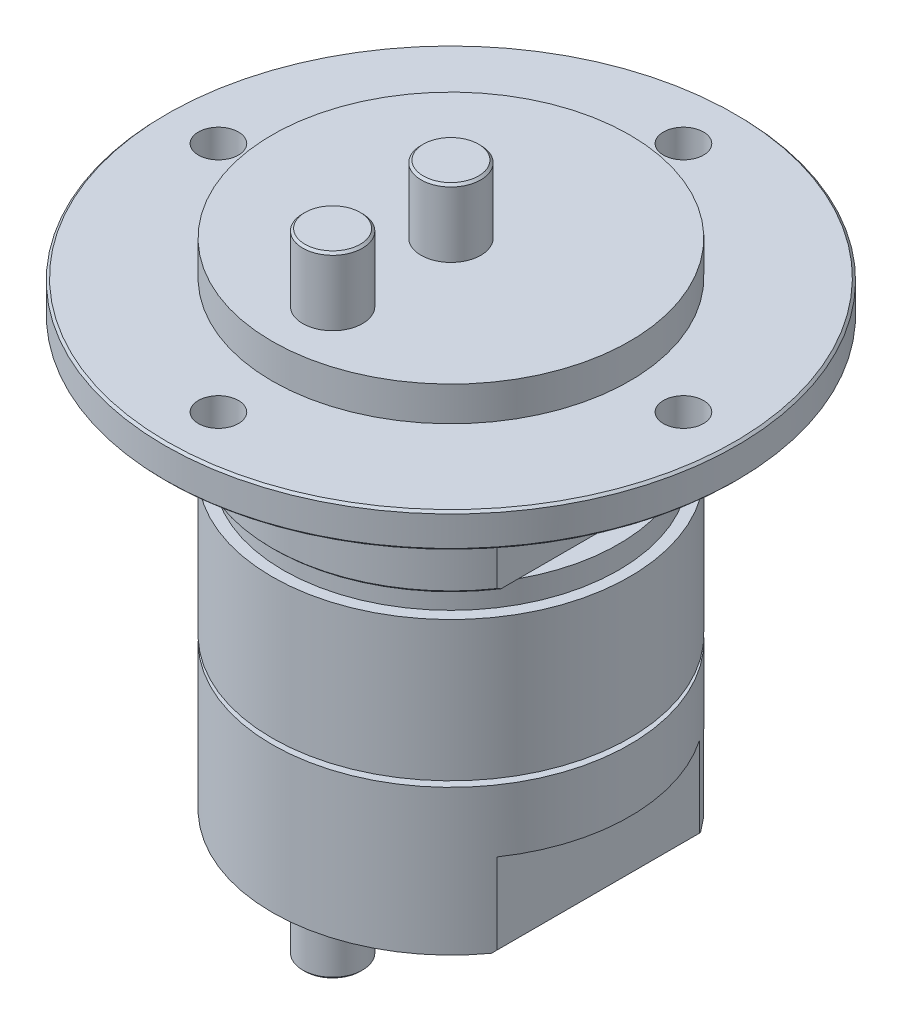
ISO-10303-21;
HEADER;
FILE_DESCRIPTION(('STEP AP214'),'2;1');
FILE_NAME('part.step','',(''),(''),'','','');
FILE_SCHEMA(('AUTOMOTIVE_DESIGN { 1 0 10303 214 1 1 1 1 }'));
ENDSEC;
DATA;
#1=APPLICATION_CONTEXT('core data for automotive mechanical design processes');
#2=APPLICATION_PROTOCOL_DEFINITION('international standard','automotive_design',2000,#1);
#3=PRODUCT_CONTEXT('',#1,'mechanical');
#4=PRODUCT('Part','Part','',(#3));
#5=PRODUCT_RELATED_PRODUCT_CATEGORY('part','',(#4));
#6=PRODUCT_DEFINITION_FORMATION('','',#4);
#7=PRODUCT_DEFINITION_CONTEXT('part definition',#1,'design');
#8=PRODUCT_DEFINITION('design','',#6,#7);
#9=PRODUCT_DEFINITION_SHAPE('','',#8);
#10=(LENGTH_UNIT() NAMED_UNIT(*) SI_UNIT(.MILLI.,.METRE.));
#11=(NAMED_UNIT(*) PLANE_ANGLE_UNIT() SI_UNIT($,.RADIAN.));
#12=(NAMED_UNIT(*) SI_UNIT($,.STERADIAN.) SOLID_ANGLE_UNIT());
#13=UNCERTAINTY_MEASURE_WITH_UNIT(LENGTH_MEASURE(1.E-05),#10,'distance_accuracy_value','');
#14=(GEOMETRIC_REPRESENTATION_CONTEXT(3) GLOBAL_UNCERTAINTY_ASSIGNED_CONTEXT((#13)) GLOBAL_UNIT_ASSIGNED_CONTEXT((#10,
#11,#12)) REPRESENTATION_CONTEXT('',''));
#15=CARTESIAN_POINT('',(0.,0.,0.));
#16=DIRECTION('',(0.,0.,1.));
#17=DIRECTION('',(1.,0.,0.));
#18=AXIS2_PLACEMENT_3D('',#15,#16,#17);
#19=CARTESIAN_POINT('',(0.,50.7192813475427,0.));
#20=DIRECTION('',(0.,1.,0.));
#21=DIRECTION('',(0.,0.,1.));
#22=AXIS2_PLACEMENT_3D('',#19,#20,#21);
#23=CYLINDRICAL_SURFACE('',#22,15.875);
#24=CARTESIAN_POINT('',(0.,-3.05,0.));
#25=DIRECTION('',(0.,1.,0.));
#26=DIRECTION('',(0.,0.,1.));
#27=AXIS2_PLACEMENT_3D('',#24,#25,#26);
#28=CIRCLE('',#27,15.875);
#29=CARTESIAN_POINT('',(0.,-3.05,15.875));
#30=VERTEX_POINT('',#29);
#31=EDGE_CURVE('E448',#30,#30,#28,.T.);
#32=ORIENTED_EDGE('',*,*,#31,.F.);
#33=EDGE_LOOP('',(#32));
#34=FACE_BOUND('',#33,.T.);
#35=DIRECTION('',(0.,1.,0.));
#36=VECTOR('',#35,1.);
#37=CARTESIAN_POINT('',(13.08,50.7192813475427,-8.99606719628081));
#38=LINE('',#37,#36);
#39=CARTESIAN_POINT('',(13.08,-5.65,-8.99606719628081));
#40=VERTEX_POINT('',#39);
#41=CARTESIAN_POINT('',(13.08,-12.85,-8.99606719628081));
#42=VERTEX_POINT('',#41);
#43=EDGE_CURVE('E524',#40,#42,#38,.F.);
#44=ORIENTED_EDGE('',*,*,#43,.T.);
#45=CARTESIAN_POINT('',(0.,-12.85,0.));
#46=DIRECTION('',(0.,-1.,0.));
#47=DIRECTION('',(0.,0.,-1.));
#48=AXIS2_PLACEMENT_3D('',#45,#46,#47);
#49=CIRCLE('',#48,15.875);
#50=CARTESIAN_POINT('',(-13.08,-12.85,-8.99606719628081));
#51=VERTEX_POINT('',#50);
#52=EDGE_CURVE('E223',#42,#51,#49,.F.);
#53=ORIENTED_EDGE('',*,*,#52,.T.);
#54=DIRECTION('',(0.,1.,0.));
#55=VECTOR('',#54,1.);
#56=CARTESIAN_POINT('',(-13.08,50.7192813475427,-8.99606719628081));
#57=LINE('',#56,#55);
#58=CARTESIAN_POINT('',(-13.08,-5.65,-8.99606719628081));
#59=VERTEX_POINT('',#58);
#60=EDGE_CURVE('E532',#59,#51,#57,.F.);
#61=ORIENTED_EDGE('',*,*,#60,.F.);
#62=CARTESIAN_POINT('',(0.,-5.65,0.));
#63=DIRECTION('',(0.,1.,0.));
#64=DIRECTION('',(0.,0.,1.));
#65=AXIS2_PLACEMENT_3D('',#62,#63,#64);
#66=CIRCLE('',#65,15.875);
#67=CARTESIAN_POINT('',(-13.08,-5.65,8.99606719628081));
#68=VERTEX_POINT('',#67);
#69=EDGE_CURVE('E159',#68,#59,#66,.F.);
#70=ORIENTED_EDGE('',*,*,#69,.F.);
#71=DIRECTION('',(0.,1.,0.));
#72=VECTOR('',#71,1.);
#73=CARTESIAN_POINT('',(-13.08,50.7192813475427,8.99606719628081));
#74=LINE('',#73,#72);
#75=CARTESIAN_POINT('',(-13.08,-12.85,8.99606719628081));
#76=VERTEX_POINT('',#75);
#77=EDGE_CURVE('E530',#76,#68,#74,.T.);
#78=ORIENTED_EDGE('',*,*,#77,.F.);
#79=CARTESIAN_POINT('',(0.,-12.85,0.));
#80=DIRECTION('',(0.,-1.,0.));
#81=DIRECTION('',(0.,0.,-1.));
#82=AXIS2_PLACEMENT_3D('',#79,#80,#81);
#83=CIRCLE('',#82,15.875);
#84=CARTESIAN_POINT('',(13.08,-12.85,8.99606719628081));
#85=VERTEX_POINT('',#84);
#86=EDGE_CURVE('E220',#76,#85,#83,.F.);
#87=ORIENTED_EDGE('',*,*,#86,.T.);
#88=DIRECTION('',(0.,1.,0.));
#89=VECTOR('',#88,1.);
#90=CARTESIAN_POINT('',(13.08,50.7192813475427,8.99606719628081));
#91=LINE('',#90,#89);
#92=CARTESIAN_POINT('',(13.08,-5.65,8.99606719628081));
#93=VERTEX_POINT('',#92);
#94=EDGE_CURVE('E147',#85,#93,#91,.T.);
#95=ORIENTED_EDGE('',*,*,#94,.T.);
#96=CARTESIAN_POINT('',(0.,-5.65,0.));
#97=DIRECTION('',(0.,-1.,0.));
#98=DIRECTION('',(0.,0.,-1.));
#99=AXIS2_PLACEMENT_3D('',#96,#97,#98);
#100=CIRCLE('',#99,15.875);
#101=EDGE_CURVE('E158',#93,#40,#100,.F.);
#102=ORIENTED_EDGE('',*,*,#101,.T.);
#103=EDGE_LOOP('',(#44,#53,#61,#70,#78,#87,#95,#102));
#104=FACE_BOUND('',#103,.T.);
#105=ADVANCED_FACE('F34',(#34,#104),#23,.T.);
#106=CARTESIAN_POINT('',(-15.875,-13.05,0.));
#107=DIRECTION('',(0.,-1.,0.));
#108=DIRECTION('',(0.,0.,-1.));
#109=AXIS2_PLACEMENT_3D('',#106,#107,#108);
#110=PLANE('',#109);
#111=DIRECTION('',(0.,0.,1.));
#112=VECTOR('',#111,1.);
#113=CARTESIAN_POINT('',(-13.08,-13.05,-25.4));
#114=LINE('',#113,#112);
#115=CARTESIAN_POINT('',(-13.08,-13.05,-8.63824200864963));
#116=VERTEX_POINT('',#115);
#117=CARTESIAN_POINT('',(-13.08,-13.05,-7.08372959675902));
#118=VERTEX_POINT('',#117);
#119=EDGE_CURVE('E514',#116,#118,#114,.T.);
#120=ORIENTED_EDGE('',*,*,#119,.F.);
#121=CARTESIAN_POINT('',(0.,-13.05,0.));
#122=DIRECTION('',(0.,-1.,0.));
#123=DIRECTION('',(0.,0.,-1.));
#124=AXIS2_PLACEMENT_3D('',#121,#122,#123);
#125=CIRCLE('',#124,15.675);
#126=CARTESIAN_POINT('',(13.08,-13.05,-8.63824200864963));
#127=VERTEX_POINT('',#126);
#128=EDGE_CURVE('E58',#116,#127,#125,.T.);
#129=ORIENTED_EDGE('',*,*,#128,.T.);
#130=DIRECTION('',(0.,0.,1.));
#131=VECTOR('',#130,1.);
#132=CARTESIAN_POINT('',(13.08,-13.05,-25.4));
#133=LINE('',#132,#131);
#134=CARTESIAN_POINT('',(13.08,-13.05,-7.08372959675902));
#135=VERTEX_POINT('',#134);
#136=EDGE_CURVE('E431',#127,#135,#133,.T.);
#137=ORIENTED_EDGE('',*,*,#136,.T.);
#138=CARTESIAN_POINT('',(0.,-13.05,0.));
#139=DIRECTION('',(0.,1.,0.));
#140=DIRECTION('',(0.,0.,1.));
#141=AXIS2_PLACEMENT_3D('',#138,#139,#140);
#142=CIRCLE('',#141,14.875);
#143=EDGE_CURVE('E442',#135,#118,#142,.T.);
#144=ORIENTED_EDGE('',*,*,#143,.T.);
#145=EDGE_LOOP('',(#120,#129,#137,#144));
#146=FACE_BOUND('',#145,.T.);
#147=ADVANCED_FACE('F336',(#146),#110,.T.);
#148=CARTESIAN_POINT('',(13.08,-13.05,7.08372959675902));
#149=VERTEX_POINT('',#148);
#150=CARTESIAN_POINT('',(13.08,-13.05,8.63824200864963));
#151=VERTEX_POINT('',#150);
#152=EDGE_CURVE('E432',#149,#151,#133,.T.);
#153=ORIENTED_EDGE('',*,*,#152,.T.);
#154=CARTESIAN_POINT('',(0.,-13.05,0.));
#155=DIRECTION('',(0.,-1.,0.));
#156=DIRECTION('',(0.,0.,-1.));
#157=AXIS2_PLACEMENT_3D('',#154,#155,#156);
#158=CIRCLE('',#157,15.675);
#159=CARTESIAN_POINT('',(-13.08,-13.05,8.63824200864963));
#160=VERTEX_POINT('',#159);
#161=EDGE_CURVE('E11',#151,#160,#158,.T.);
#162=ORIENTED_EDGE('',*,*,#161,.T.);
#163=CARTESIAN_POINT('',(-13.08,-13.05,7.08372959675902));
#164=VERTEX_POINT('',#163);
#165=EDGE_CURVE('E446',#164,#160,#114,.T.);
#166=ORIENTED_EDGE('',*,*,#165,.F.);
#167=EDGE_CURVE('E440',#164,#149,#142,.T.);
#168=ORIENTED_EDGE('',*,*,#167,.T.);
#169=EDGE_LOOP('',(#153,#162,#166,#168));
#170=FACE_BOUND('',#169,.T.);
#171=ADVANCED_FACE('F310',(#170),#110,.T.);
#172=CARTESIAN_POINT('',(0.,50.7192813475427,0.));
#173=DIRECTION('',(0.,1.,0.));
#174=DIRECTION('',(0.,0.,1.));
#175=AXIS2_PLACEMENT_3D('',#172,#173,#174);
#176=CYLINDRICAL_SURFACE('',#175,15.875);
#177=CARTESIAN_POINT('',(0.,-27.95,0.));
#178=DIRECTION('',(0.,1.,0.));
#179=DIRECTION('',(0.,0.,1.));
#180=AXIS2_PLACEMENT_3D('',#177,#178,#179);
#181=CIRCLE('',#180,15.875);
#182=CARTESIAN_POINT('',(0.,-27.95,15.875));
#183=VERTEX_POINT('',#182);
#184=EDGE_CURVE('E497',#183,#183,#181,.T.);
#185=ORIENTED_EDGE('',*,*,#184,.F.);
#186=EDGE_LOOP('',(#185));
#187=FACE_BOUND('',#186,.T.);
#188=CARTESIAN_POINT('',(0.,-40.85,0.));
#189=DIRECTION('',(0.,1.,0.));
#190=DIRECTION('',(0.,0.,1.));
#191=AXIS2_PLACEMENT_3D('',#188,#189,#190);
#192=CIRCLE('',#191,15.875);
#193=CARTESIAN_POINT('',(-12.88,-40.85,9.28015220780346));
#194=VERTEX_POINT('',#193);
#195=CARTESIAN_POINT('',(12.88,-40.85,9.28015220780346));
#196=VERTEX_POINT('',#195);
#197=EDGE_CURVE('E495',#194,#196,#192,.T.);
#198=ORIENTED_EDGE('',*,*,#197,.T.);
#199=CARTESIAN_POINT('',(0.,-53.7299999999999,0.));
#200=DIRECTION('',(-0.707106781186544,0.707106781186551,0.));
#201=DIRECTION('',(0.707106781186551,0.707106781186544,0.));
#202=AXIS2_PLACEMENT_3D('',#199,#200,#201);
#203=ELLIPSE('',#202,22.4506403026728,15.875);
#204=CARTESIAN_POINT('',(13.08,-40.65,8.99606719628081));
#205=VERTEX_POINT('',#204);
#206=EDGE_CURVE('E178',#196,#205,#203,.T.);
#207=ORIENTED_EDGE('',*,*,#206,.T.);
#208=DIRECTION('',(0.,1.,0.));
#209=VECTOR('',#208,1.);
#210=CARTESIAN_POINT('',(13.08,50.7192813475427,8.99606719628081));
#211=LINE('',#210,#209);
#212=CARTESIAN_POINT('',(13.08,-33.4849643358104,8.99606719628081));
#213=VERTEX_POINT('',#212);
#214=EDGE_CURVE('E148',#205,#213,#211,.T.);
#215=ORIENTED_EDGE('',*,*,#214,.T.);
#216=CARTESIAN_POINT('',(0.,-33.4849643358104,0.));
#217=DIRECTION('',(0.,-1.,0.));
#218=DIRECTION('',(0.,0.,-1.));
#219=AXIS2_PLACEMENT_3D('',#216,#217,#218);
#220=CIRCLE('',#219,15.875);
#221=CARTESIAN_POINT('',(13.08,-33.4849643358104,-8.99606719628081));
#222=VERTEX_POINT('',#221);
#223=EDGE_CURVE('E153',#213,#222,#220,.F.);
#224=ORIENTED_EDGE('',*,*,#223,.T.);
#225=DIRECTION('',(0.,1.,0.));
#226=VECTOR('',#225,1.);
#227=CARTESIAN_POINT('',(13.08,50.7192813475427,-8.99606719628081));
#228=LINE('',#227,#226);
#229=CARTESIAN_POINT('',(13.08,-40.65,-8.99606719628081));
#230=VERTEX_POINT('',#229);
#231=EDGE_CURVE('E137',#222,#230,#228,.F.);
#232=ORIENTED_EDGE('',*,*,#231,.T.);
#233=CARTESIAN_POINT('',(0.,-53.7299999999999,0.));
#234=DIRECTION('',(-0.707106781186544,0.707106781186551,0.));
#235=DIRECTION('',(0.707106781186551,0.707106781186544,0.));
#236=AXIS2_PLACEMENT_3D('',#233,#234,#235);
#237=ELLIPSE('',#236,22.4506403026728,15.875);
#238=CARTESIAN_POINT('',(12.88,-40.85,-9.28015220780346));
#239=VERTEX_POINT('',#238);
#240=EDGE_CURVE('E176',#230,#239,#237,.T.);
#241=ORIENTED_EDGE('',*,*,#240,.T.);
#242=CARTESIAN_POINT('',(-12.88,-40.85,-9.28015220780346));
#243=VERTEX_POINT('',#242);
#244=EDGE_CURVE('E481',#239,#243,#192,.T.);
#245=ORIENTED_EDGE('',*,*,#244,.T.);
#246=CARTESIAN_POINT('',(0.,-53.73,0.));
#247=DIRECTION('',(-0.707106781186548,-0.707106781186548,0.));
#248=DIRECTION('',(-0.707106781186548,0.707106781186548,0.));
#249=AXIS2_PLACEMENT_3D('',#246,#247,#248);
#250=ELLIPSE('',#249,22.4506403026729,15.875);
#251=CARTESIAN_POINT('',(-13.08,-40.65,-8.99606719628081));
#252=VERTEX_POINT('',#251);
#253=EDGE_CURVE('E172',#243,#252,#250,.F.);
#254=ORIENTED_EDGE('',*,*,#253,.T.);
#255=DIRECTION('',(0.,1.,0.));
#256=VECTOR('',#255,1.);
#257=CARTESIAN_POINT('',(-13.08,50.7192813475427,-8.99606719628081));
#258=LINE('',#257,#256);
#259=CARTESIAN_POINT('',(-13.08,-33.4849643358104,-8.99606719628081));
#260=VERTEX_POINT('',#259);
#261=EDGE_CURVE('E527',#260,#252,#258,.F.);
#262=ORIENTED_EDGE('',*,*,#261,.F.);
#263=CARTESIAN_POINT('',(0.,-33.4849643358104,0.));
#264=DIRECTION('',(0.,1.,0.));
#265=DIRECTION('',(0.,0.,1.));
#266=AXIS2_PLACEMENT_3D('',#263,#264,#265);
#267=CIRCLE('',#266,15.875);
#268=CARTESIAN_POINT('',(-13.08,-33.4849643358104,8.99606719628081));
#269=VERTEX_POINT('',#268);
#270=EDGE_CURVE('E164',#269,#260,#267,.F.);
#271=ORIENTED_EDGE('',*,*,#270,.F.);
#272=DIRECTION('',(0.,1.,0.));
#273=VECTOR('',#272,1.);
#274=CARTESIAN_POINT('',(-13.08,50.7192813475427,8.99606719628081));
#275=LINE('',#274,#273);
#276=CARTESIAN_POINT('',(-13.08,-40.65,8.99606719628081));
#277=VERTEX_POINT('',#276);
#278=EDGE_CURVE('E525',#277,#269,#275,.T.);
#279=ORIENTED_EDGE('',*,*,#278,.F.);
#280=CARTESIAN_POINT('',(0.,-53.73,0.));
#281=DIRECTION('',(-0.707106781186548,-0.707106781186548,0.));
#282=DIRECTION('',(-0.707106781186548,0.707106781186548,0.));
#283=AXIS2_PLACEMENT_3D('',#280,#281,#282);
#284=ELLIPSE('',#283,22.4506403026729,15.875);
#285=EDGE_CURVE('E174',#277,#194,#284,.F.);
#286=ORIENTED_EDGE('',*,*,#285,.T.);
#287=EDGE_LOOP('',(#198,#207,#215,#224,#232,#241,#245,#254,#262,#271,#279,#286));
#288=FACE_BOUND('',#287,.T.);
#289=ADVANCED_FACE('F157',(#187,#288),#176,.T.);
#290=CARTESIAN_POINT('',(-15.875,-40.85,0.));
#291=DIRECTION('',(0.,-1.,0.));
#292=DIRECTION('',(0.,0.,-1.));
#293=AXIS2_PLACEMENT_3D('',#290,#291,#292);
#294=PLANE('',#293);
#295=CARTESIAN_POINT('',(0.,-40.85,10.5));
#296=DIRECTION('',(0.,-1.,0.));
#297=DIRECTION('',(0.,0.,-1.));
#298=AXIS2_PLACEMENT_3D('',#295,#296,#297);
#299=CIRCLE('',#298,2.65);
#300=CARTESIAN_POINT('',(0.,-40.85,7.85));
#301=VERTEX_POINT('',#300);
#302=EDGE_CURVE('E465',#301,#301,#299,.T.);
#303=ORIENTED_EDGE('',*,*,#302,.F.);
#304=EDGE_LOOP('',(#303));
#305=FACE_BOUND('',#304,.T.);
#306=CARTESIAN_POINT('',(0.,-40.85,0.));
#307=DIRECTION('',(0.,-1.,0.));
#308=DIRECTION('',(0.,0.,-1.));
#309=AXIS2_PLACEMENT_3D('',#306,#307,#308);
#310=CIRCLE('',#309,2.65);
#311=CARTESIAN_POINT('',(0.,-40.85,-2.65));
#312=VERTEX_POINT('',#311);
#313=EDGE_CURVE('E461',#312,#312,#310,.T.);
#314=ORIENTED_EDGE('',*,*,#313,.F.);
#315=EDGE_LOOP('',(#314));
#316=FACE_BOUND('',#315,.T.);
#317=ORIENTED_EDGE('',*,*,#244,.F.);
#318=DIRECTION('',(0.,0.,1.));
#319=VECTOR('',#318,1.);
#320=CARTESIAN_POINT('',(12.88,-40.85,0.));
#321=LINE('',#320,#319);
#322=EDGE_CURVE('E169',#239,#196,#321,.T.);
#323=ORIENTED_EDGE('',*,*,#322,.T.);
#324=ORIENTED_EDGE('',*,*,#197,.F.);
#325=DIRECTION('',(0.,0.,-1.));
#326=VECTOR('',#325,1.);
#327=CARTESIAN_POINT('',(-12.88,-40.85,-8.99606719628081));
#328=LINE('',#327,#326);
#329=EDGE_CURVE('E162',#194,#243,#328,.T.);
#330=ORIENTED_EDGE('',*,*,#329,.T.);
#331=EDGE_LOOP('',(#317,#323,#324,#330));
#332=FACE_BOUND('',#331,.T.);
#333=ADVANCED_FACE('F303',(#305,#316,#332),#294,.T.);
#334=CARTESIAN_POINT('',(0.,3.05,0.));
#335=DIRECTION('',(0.,1.,0.));
#336=DIRECTION('',(0.,0.,1.));
#337=AXIS2_PLACEMENT_3D('',#334,#335,#336);
#338=PLANE('',#337);
#339=CARTESIAN_POINT('',(0.,3.05,10.5));
#340=DIRECTION('',(0.,1.,0.));
#341=DIRECTION('',(0.,0.,1.));
#342=AXIS2_PLACEMENT_3D('',#339,#340,#341);
#343=CIRCLE('',#342,2.65);
#344=CARTESIAN_POINT('',(0.,3.05,13.15));
#345=VERTEX_POINT('',#344);
#346=EDGE_CURVE('E468',#345,#345,#343,.T.);
#347=ORIENTED_EDGE('',*,*,#346,.F.);
#348=EDGE_LOOP('',(#347));
#349=FACE_BOUND('',#348,.T.);
#350=CARTESIAN_POINT('',(0.,3.05,0.));
#351=DIRECTION('',(0.,1.,0.));
#352=DIRECTION('',(0.,0.,1.));
#353=AXIS2_PLACEMENT_3D('',#350,#351,#352);
#354=CIRCLE('',#353,2.65);
#355=CARTESIAN_POINT('',(0.,3.05,2.65));
#356=VERTEX_POINT('',#355);
#357=EDGE_CURVE('E464',#356,#356,#354,.T.);
#358=ORIENTED_EDGE('',*,*,#357,.F.);
#359=EDGE_LOOP('',(#358));
#360=FACE_BOUND('',#359,.T.);
#361=CARTESIAN_POINT('',(0.,3.05,0.));
#362=DIRECTION('',(0.,1.,0.));
#363=DIRECTION('',(0.,0.,1.));
#364=AXIS2_PLACEMENT_3D('',#361,#362,#363);
#365=CIRCLE('',#364,15.875);
#366=CARTESIAN_POINT('',(0.,3.05,15.875));
#367=VERTEX_POINT('',#366);
#368=EDGE_CURVE('E458',#367,#367,#365,.T.);
#369=ORIENTED_EDGE('',*,*,#368,.T.);
#370=EDGE_LOOP('',(#369));
#371=FACE_BOUND('',#370,.T.);
#372=ADVANCED_FACE('F306',(#349,#360,#371),#338,.T.);
#373=CARTESIAN_POINT('',(0.,50.7192813475427,0.));
#374=DIRECTION('',(0.,1.,0.));
#375=DIRECTION('',(0.,0.,1.));
#376=AXIS2_PLACEMENT_3D('',#373,#374,#375);
#377=CYLINDRICAL_SURFACE('',#376,15.875);
#378=CARTESIAN_POINT('',(0.,0.,0.));
#379=DIRECTION('',(0.,1.,0.));
#380=DIRECTION('',(0.,0.,1.));
#381=AXIS2_PLACEMENT_3D('',#378,#379,#380);
#382=CIRCLE('',#381,15.875);
#383=CARTESIAN_POINT('',(0.,0.,15.875));
#384=VERTEX_POINT('',#383);
#385=EDGE_CURVE('E455',#384,#384,#382,.T.);
#386=ORIENTED_EDGE('',*,*,#385,.T.);
#387=EDGE_LOOP('',(#386));
#388=FACE_BOUND('',#387,.T.);
#389=ORIENTED_EDGE('',*,*,#368,.F.);
#390=EDGE_LOOP('',(#389));
#391=FACE_BOUND('',#390,.T.);
#392=ADVANCED_FACE('F352',(#388,#391),#377,.T.);
#393=CARTESIAN_POINT('',(-15.875,0.,0.));
#394=DIRECTION('',(0.,1.,0.));
#395=DIRECTION('',(0.,0.,1.));
#396=AXIS2_PLACEMENT_3D('',#393,#394,#395);
#397=PLANE('',#396);
#398=CARTESIAN_POINT('',(0.,0.,0.));
#399=DIRECTION('',(0.,1.,0.));
#400=DIRECTION('',(0.,0.,1.));
#401=AXIS2_PLACEMENT_3D('',#398,#399,#400);
#402=CIRCLE('',#401,25.2);
#403=CARTESIAN_POINT('',(0.,0.,25.2));
#404=VERTEX_POINT('',#403);
#405=EDGE_CURVE('E217',#404,#404,#402,.T.);
#406=ORIENTED_EDGE('',*,*,#405,.T.);
#407=EDGE_LOOP('',(#406));
#408=FACE_BOUND('',#407,.T.);
#409=CARTESIAN_POINT('',(0.,0.,-20.64));
#410=DIRECTION('',(0.,1.,0.));
#411=DIRECTION('',(0.,0.,1.));
#412=AXIS2_PLACEMENT_3D('',#409,#410,#411);
#413=CIRCLE('',#412,1.78);
#414=CARTESIAN_POINT('',(0.,0.,-18.86));
#415=VERTEX_POINT('',#414);
#416=EDGE_CURVE('E473',#415,#415,#413,.T.);
#417=ORIENTED_EDGE('',*,*,#416,.F.);
#418=EDGE_LOOP('',(#417));
#419=FACE_BOUND('',#418,.T.);
#420=CARTESIAN_POINT('',(-20.64,0.,0.));
#421=DIRECTION('',(0.,1.,0.));
#422=DIRECTION('',(0.,0.,1.));
#423=AXIS2_PLACEMENT_3D('',#420,#421,#422);
#424=CIRCLE('',#423,1.78);
#425=CARTESIAN_POINT('',(-20.64,0.,1.78));
#426=VERTEX_POINT('',#425);
#427=EDGE_CURVE('E537',#426,#426,#424,.T.);
#428=ORIENTED_EDGE('',*,*,#427,.F.);
#429=EDGE_LOOP('',(#428));
#430=FACE_BOUND('',#429,.T.);
#431=CARTESIAN_POINT('',(0.,0.,20.64));
#432=DIRECTION('',(0.,1.,0.));
#433=DIRECTION('',(0.,0.,1.));
#434=AXIS2_PLACEMENT_3D('',#431,#432,#433);
#435=CIRCLE('',#434,1.78);
#436=CARTESIAN_POINT('',(0.,0.,22.42));
#437=VERTEX_POINT('',#436);
#438=EDGE_CURVE('E539',#437,#437,#435,.T.);
#439=ORIENTED_EDGE('',*,*,#438,.F.);
#440=EDGE_LOOP('',(#439));
#441=FACE_BOUND('',#440,.T.);
#442=CARTESIAN_POINT('',(20.64,0.,0.));
#443=DIRECTION('',(0.,1.,0.));
#444=DIRECTION('',(0.,0.,1.));
#445=AXIS2_PLACEMENT_3D('',#442,#443,#444);
#446=CIRCLE('',#445,1.78);
#447=CARTESIAN_POINT('',(20.64,0.,1.78));
#448=VERTEX_POINT('',#447);
#449=EDGE_CURVE('E491',#448,#448,#446,.T.);
#450=ORIENTED_EDGE('',*,*,#449,.F.);
#451=EDGE_LOOP('',(#450));
#452=FACE_BOUND('',#451,.T.);
#453=ORIENTED_EDGE('',*,*,#385,.F.);
#454=EDGE_LOOP('',(#453));
#455=FACE_BOUND('',#454,.T.);
#456=ADVANCED_FACE('F348',(#408,#419,#430,#441,#452,#455),#397,.T.);
#457=CARTESIAN_POINT('',(0.,50.7192813475427,0.));
#458=DIRECTION('',(0.,1.,0.));
#459=DIRECTION('',(0.,0.,1.));
#460=AXIS2_PLACEMENT_3D('',#457,#458,#459);
#461=CYLINDRICAL_SURFACE('',#460,25.4);
#462=CARTESIAN_POINT('',(0.,-2.84999999999999,0.));
#463=DIRECTION('',(0.,-1.,0.));
#464=DIRECTION('',(0.,0.,-1.));
#465=AXIS2_PLACEMENT_3D('',#462,#463,#464);
#466=CIRCLE('',#465,25.4);
#467=CARTESIAN_POINT('',(0.,-2.84999999999999,-25.4));
#468=VERTEX_POINT('',#467);
#469=EDGE_CURVE('E211',#468,#468,#466,.F.);
#470=ORIENTED_EDGE('',*,*,#469,.T.);
#471=EDGE_LOOP('',(#470));
#472=FACE_BOUND('',#471,.T.);
#473=CARTESIAN_POINT('',(0.,-0.199999999999999,0.));
#474=DIRECTION('',(0.,1.,0.));
#475=DIRECTION('',(0.,0.,1.));
#476=AXIS2_PLACEMENT_3D('',#473,#474,#475);
#477=CIRCLE('',#476,25.4);
#478=CARTESIAN_POINT('',(0.,-0.199999999999999,25.4));
#479=VERTEX_POINT('',#478);
#480=EDGE_CURVE('E208',#479,#479,#477,.F.);
#481=ORIENTED_EDGE('',*,*,#480,.T.);
#482=EDGE_LOOP('',(#481));
#483=FACE_BOUND('',#482,.T.);
#484=ADVANCED_FACE('F344',(#472,#483),#461,.T.);
#485=CARTESIAN_POINT('',(-25.4,-3.05,0.));
#486=DIRECTION('',(0.,-1.,0.));
#487=DIRECTION('',(0.,0.,-1.));
#488=AXIS2_PLACEMENT_3D('',#485,#486,#487);
#489=PLANE('',#488);
#490=CARTESIAN_POINT('',(0.,-3.05,0.));
#491=DIRECTION('',(0.,-1.,0.));
#492=DIRECTION('',(0.,0.,-1.));
#493=AXIS2_PLACEMENT_3D('',#490,#491,#492);
#494=CIRCLE('',#493,25.2);
#495=CARTESIAN_POINT('',(0.,-3.05,-25.2));
#496=VERTEX_POINT('',#495);
#497=EDGE_CURVE('E214',#496,#496,#494,.T.);
#498=ORIENTED_EDGE('',*,*,#497,.T.);
#499=EDGE_LOOP('',(#498));
#500=FACE_BOUND('',#499,.T.);
#501=CARTESIAN_POINT('',(0.,-3.05,-20.64));
#502=DIRECTION('',(0.,-1.,0.));
#503=DIRECTION('',(0.,0.,-1.));
#504=AXIS2_PLACEMENT_3D('',#501,#502,#503);
#505=CIRCLE('',#504,1.78);
#506=CARTESIAN_POINT('',(0.,-3.05,-22.42));
#507=VERTEX_POINT('',#506);
#508=EDGE_CURVE('E479',#507,#507,#505,.T.);
#509=ORIENTED_EDGE('',*,*,#508,.F.);
#510=EDGE_LOOP('',(#509));
#511=FACE_BOUND('',#510,.T.);
#512=CARTESIAN_POINT('',(-20.64,-3.05,0.));
#513=DIRECTION('',(0.,-1.,0.));
#514=DIRECTION('',(0.,0.,-1.));
#515=AXIS2_PLACEMENT_3D('',#512,#513,#514);
#516=CIRCLE('',#515,1.78);
#517=CARTESIAN_POINT('',(-20.64,-3.05,-1.78));
#518=VERTEX_POINT('',#517);
#519=EDGE_CURVE('E476',#518,#518,#516,.T.);
#520=ORIENTED_EDGE('',*,*,#519,.F.);
#521=EDGE_LOOP('',(#520));
#522=FACE_BOUND('',#521,.T.);
#523=CARTESIAN_POINT('',(0.,-3.05,20.64));
#524=DIRECTION('',(0.,-1.,0.));
#525=DIRECTION('',(0.,0.,-1.));
#526=AXIS2_PLACEMENT_3D('',#523,#524,#525);
#527=CIRCLE('',#526,1.78);
#528=CARTESIAN_POINT('',(0.,-3.05,18.86));
#529=VERTEX_POINT('',#528);
#530=EDGE_CURVE('E472',#529,#529,#527,.T.);
#531=ORIENTED_EDGE('',*,*,#530,.F.);
#532=EDGE_LOOP('',(#531));
#533=FACE_BOUND('',#532,.T.);
#534=CARTESIAN_POINT('',(20.64,-3.05,0.));
#535=DIRECTION('',(0.,-1.,0.));
#536=DIRECTION('',(0.,0.,-1.));
#537=AXIS2_PLACEMENT_3D('',#534,#535,#536);
#538=CIRCLE('',#537,1.78);
#539=CARTESIAN_POINT('',(20.64,-3.05,-1.78));
#540=VERTEX_POINT('',#539);
#541=EDGE_CURVE('E469',#540,#540,#538,.T.);
#542=ORIENTED_EDGE('',*,*,#541,.F.);
#543=EDGE_LOOP('',(#542));
#544=FACE_BOUND('',#543,.T.);
#545=ORIENTED_EDGE('',*,*,#31,.T.);
#546=EDGE_LOOP('',(#545));
#547=FACE_BOUND('',#546,.T.);
#548=ADVANCED_FACE('F334',(#500,#511,#522,#533,#544,#547),#489,.T.);
#549=CARTESIAN_POINT('',(0.,50.7192813475427,0.));
#550=DIRECTION('',(0.,1.,0.));
#551=DIRECTION('',(0.,0.,1.));
#552=AXIS2_PLACEMENT_3D('',#549,#550,#551);
#553=CYLINDRICAL_SURFACE('',#552,14.875);
#554=CARTESIAN_POINT('',(0.,-15.05,0.));
#555=DIRECTION('',(0.,1.,0.));
#556=DIRECTION('',(0.,0.,1.));
#557=AXIS2_PLACEMENT_3D('',#554,#555,#556);
#558=CIRCLE('',#557,14.875);
#559=CARTESIAN_POINT('',(0.,-15.05,14.875));
#560=VERTEX_POINT('',#559);
#561=EDGE_CURVE('E451',#560,#560,#558,.T.);
#562=ORIENTED_EDGE('',*,*,#561,.T.);
#563=EDGE_LOOP('',(#562));
#564=FACE_BOUND('',#563,.T.);
#565=EDGE_CURVE('E447',#118,#164,#142,.T.);
#566=ORIENTED_EDGE('',*,*,#565,.F.);
#567=ORIENTED_EDGE('',*,*,#143,.F.);
#568=EDGE_CURVE('E429',#149,#135,#142,.T.);
#569=ORIENTED_EDGE('',*,*,#568,.F.);
#570=ORIENTED_EDGE('',*,*,#167,.F.);
#571=EDGE_LOOP('',(#566,#567,#569,#570));
#572=FACE_BOUND('',#571,.T.);
#573=ADVANCED_FACE('F330',(#564,#572),#553,.T.);
#574=CARTESIAN_POINT('',(-14.875,-15.05,0.));
#575=DIRECTION('',(0.,1.,0.));
#576=DIRECTION('',(0.,0.,1.));
#577=AXIS2_PLACEMENT_3D('',#574,#575,#576);
#578=PLANE('',#577);
#579=CARTESIAN_POINT('',(0.,-15.05,0.));
#580=DIRECTION('',(0.,1.,0.));
#581=DIRECTION('',(0.,0.,1.));
#582=AXIS2_PLACEMENT_3D('',#579,#580,#581);
#583=CIRCLE('',#582,15.875);
#584=CARTESIAN_POINT('',(0.,-15.05,15.875));
#585=VERTEX_POINT('',#584);
#586=EDGE_CURVE('E508',#585,#585,#583,.T.);
#587=ORIENTED_EDGE('',*,*,#586,.T.);
#588=EDGE_LOOP('',(#587));
#589=FACE_BOUND('',#588,.T.);
#590=ORIENTED_EDGE('',*,*,#561,.F.);
#591=EDGE_LOOP('',(#590));
#592=FACE_BOUND('',#591,.T.);
#593=ADVANCED_FACE('F326',(#589,#592),#578,.T.);
#594=CARTESIAN_POINT('',(0.,50.7192813475427,0.));
#595=DIRECTION('',(0.,1.,0.));
#596=DIRECTION('',(0.,0.,1.));
#597=AXIS2_PLACEMENT_3D('',#594,#595,#596);
#598=CYLINDRICAL_SURFACE('',#597,15.875);
#599=CARTESIAN_POINT('',(0.,-27.45,0.));
#600=DIRECTION('',(0.,1.,0.));
#601=DIRECTION('',(0.,0.,1.));
#602=AXIS2_PLACEMENT_3D('',#599,#600,#601);
#603=CIRCLE('',#602,15.875);
#604=CARTESIAN_POINT('',(0.,-27.45,15.875));
#605=VERTEX_POINT('',#604);
#606=EDGE_CURVE('E506',#605,#605,#603,.T.);
#607=ORIENTED_EDGE('',*,*,#606,.T.);
#608=EDGE_LOOP('',(#607));
#609=FACE_BOUND('',#608,.T.);
#610=ORIENTED_EDGE('',*,*,#586,.F.);
#611=EDGE_LOOP('',(#610));
#612=FACE_BOUND('',#611,.T.);
#613=ADVANCED_FACE('F322',(#609,#612),#598,.T.);
#614=CARTESIAN_POINT('',(-15.875,-27.45,0.));
#615=DIRECTION('',(0.,-1.,0.));
#616=DIRECTION('',(0.,0.,-1.));
#617=AXIS2_PLACEMENT_3D('',#614,#615,#616);
#618=PLANE('',#617);
#619=CARTESIAN_POINT('',(0.,-27.45,0.));
#620=DIRECTION('',(0.,1.,0.));
#621=DIRECTION('',(0.,0.,1.));
#622=AXIS2_PLACEMENT_3D('',#619,#620,#621);
#623=CIRCLE('',#622,14.875);
#624=CARTESIAN_POINT('',(0.,-27.45,14.875));
#625=VERTEX_POINT('',#624);
#626=EDGE_CURVE('E503',#625,#625,#623,.T.);
#627=ORIENTED_EDGE('',*,*,#626,.T.);
#628=EDGE_LOOP('',(#627));
#629=FACE_BOUND('',#628,.T.);
#630=ORIENTED_EDGE('',*,*,#606,.F.);
#631=EDGE_LOOP('',(#630));
#632=FACE_BOUND('',#631,.T.);
#633=ADVANCED_FACE('F318',(#629,#632),#618,.T.);
#634=CARTESIAN_POINT('',(0.,50.7192813475427,0.));
#635=DIRECTION('',(0.,1.,0.));
#636=DIRECTION('',(0.,0.,1.));
#637=AXIS2_PLACEMENT_3D('',#634,#635,#636);
#638=CYLINDRICAL_SURFACE('',#637,14.875);
#639=CARTESIAN_POINT('',(0.,-27.95,0.));
#640=DIRECTION('',(0.,1.,0.));
#641=DIRECTION('',(0.,0.,1.));
#642=AXIS2_PLACEMENT_3D('',#639,#640,#641);
#643=CIRCLE('',#642,14.875);
#644=CARTESIAN_POINT('',(0.,-27.95,14.875));
#645=VERTEX_POINT('',#644);
#646=EDGE_CURVE('E500',#645,#645,#643,.T.);
#647=ORIENTED_EDGE('',*,*,#646,.T.);
#648=EDGE_LOOP('',(#647));
#649=FACE_BOUND('',#648,.T.);
#650=ORIENTED_EDGE('',*,*,#626,.F.);
#651=EDGE_LOOP('',(#650));
#652=FACE_BOUND('',#651,.T.);
#653=ADVANCED_FACE('F314',(#649,#652),#638,.T.);
#654=CARTESIAN_POINT('',(-14.875,-27.95,0.));
#655=DIRECTION('',(0.,1.,0.));
#656=DIRECTION('',(0.,0.,1.));
#657=AXIS2_PLACEMENT_3D('',#654,#655,#656);
#658=PLANE('',#657);
#659=ORIENTED_EDGE('',*,*,#184,.T.);
#660=EDGE_LOOP('',(#659));
#661=FACE_BOUND('',#660,.T.);
#662=ORIENTED_EDGE('',*,*,#646,.F.);
#663=EDGE_LOOP('',(#662));
#664=FACE_BOUND('',#663,.T.);
#665=ADVANCED_FACE('F298',(#661,#664),#658,.T.);
#666=CARTESIAN_POINT('',(0.,-46.85,0.));
#667=DIRECTION('',(0.,1.,0.));
#668=DIRECTION('',(0.,0.,1.));
#669=AXIS2_PLACEMENT_3D('',#666,#667,#668);
#670=PLANE('',#669);
#671=CARTESIAN_POINT('',(0.,-46.85,0.));
#672=DIRECTION('',(0.,1.,0.));
#673=DIRECTION('',(0.,0.,1.));
#674=AXIS2_PLACEMENT_3D('',#671,#672,#673);
#675=CIRCLE('',#674,2.45000000000001);
#676=CARTESIAN_POINT('',(0.,-46.85,2.45000000000001));
#677=VERTEX_POINT('',#676);
#678=EDGE_CURVE('E193',#677,#677,#675,.F.);
#679=ORIENTED_EDGE('',*,*,#678,.T.);
#680=EDGE_LOOP('',(#679));
#681=FACE_BOUND('',#680,.T.);
#682=ADVANCED_FACE('F294',(#681),#670,.F.);
#683=CARTESIAN_POINT('',(0.,-46.85,0.));
#684=DIRECTION('',(0.,1.,0.));
#685=DIRECTION('',(0.,0.,1.));
#686=AXIS2_PLACEMENT_3D('',#683,#684,#685);
#687=CYLINDRICAL_SURFACE('',#686,2.65);
#688=CARTESIAN_POINT('',(0.,-46.65,0.));
#689=DIRECTION('',(0.,1.,0.));
#690=DIRECTION('',(0.,0.,1.));
#691=AXIS2_PLACEMENT_3D('',#688,#689,#690);
#692=CIRCLE('',#691,2.65);
#693=CARTESIAN_POINT('',(0.,-46.65,2.65));
#694=VERTEX_POINT('',#693);
#695=EDGE_CURVE('E190',#694,#694,#692,.T.);
#696=ORIENTED_EDGE('',*,*,#695,.T.);
#697=EDGE_LOOP('',(#696));
#698=FACE_BOUND('',#697,.T.);
#699=ORIENTED_EDGE('',*,*,#313,.T.);
#700=EDGE_LOOP('',(#699));
#701=FACE_BOUND('',#700,.T.);
#702=ADVANCED_FACE('F297',(#698,#701),#687,.T.);
#703=CARTESIAN_POINT('',(0.,8.85,0.));
#704=DIRECTION('',(0.,1.,0.));
#705=DIRECTION('',(0.,0.,1.));
#706=AXIS2_PLACEMENT_3D('',#703,#704,#705);
#707=CIRCLE('',#706,2.65);
#708=CARTESIAN_POINT('',(0.,8.85,2.65));
#709=VERTEX_POINT('',#708);
#710=EDGE_CURVE('E205',#709,#709,#707,.F.);
#711=ORIENTED_EDGE('',*,*,#710,.T.);
#712=EDGE_LOOP('',(#711));
#713=FACE_BOUND('',#712,.T.);
#714=ORIENTED_EDGE('',*,*,#357,.T.);
#715=EDGE_LOOP('',(#714));
#716=FACE_BOUND('',#715,.T.);
#717=ADVANCED_FACE('F292',(#713,#716),#687,.T.);
#718=CARTESIAN_POINT('',(0.,9.05,0.));
#719=DIRECTION('',(0.,1.,0.));
#720=DIRECTION('',(0.,0.,1.));
#721=AXIS2_PLACEMENT_3D('',#718,#719,#720);
#722=PLANE('',#721);
#723=CARTESIAN_POINT('',(0.,9.05,0.));
#724=DIRECTION('',(0.,1.,0.));
#725=DIRECTION('',(0.,0.,1.));
#726=AXIS2_PLACEMENT_3D('',#723,#724,#725);
#727=CIRCLE('',#726,2.45000000000001);
#728=CARTESIAN_POINT('',(0.,9.05,2.45000000000001));
#729=VERTEX_POINT('',#728);
#730=EDGE_CURVE('E202',#729,#729,#727,.T.);
#731=ORIENTED_EDGE('',*,*,#730,.T.);
#732=EDGE_LOOP('',(#731));
#733=FACE_BOUND('',#732,.T.);
#734=ADVANCED_FACE('F285',(#733),#722,.T.);
#735=CARTESIAN_POINT('',(0.,-46.85,10.5));
#736=DIRECTION('',(0.,1.,0.));
#737=DIRECTION('',(0.,0.,1.));
#738=AXIS2_PLACEMENT_3D('',#735,#736,#737);
#739=PLANE('',#738);
#740=CARTESIAN_POINT('',(0.,-46.85,10.5));
#741=DIRECTION('',(0.,1.,0.));
#742=DIRECTION('',(0.,0.,1.));
#743=AXIS2_PLACEMENT_3D('',#740,#741,#742);
#744=CIRCLE('',#743,2.45000000000001);
#745=CARTESIAN_POINT('',(0.,-46.85,12.95));
#746=VERTEX_POINT('',#745);
#747=EDGE_CURVE('E187',#746,#746,#744,.F.);
#748=ORIENTED_EDGE('',*,*,#747,.T.);
#749=EDGE_LOOP('',(#748));
#750=FACE_BOUND('',#749,.T.);
#751=ADVANCED_FACE('F281',(#750),#739,.F.);
#752=CARTESIAN_POINT('',(0.,-46.85,10.5));
#753=DIRECTION('',(0.,1.,0.));
#754=DIRECTION('',(0.,0.,1.));
#755=AXIS2_PLACEMENT_3D('',#752,#753,#754);
#756=CYLINDRICAL_SURFACE('',#755,2.65);
#757=CARTESIAN_POINT('',(0.,-46.65,10.5));
#758=DIRECTION('',(0.,1.,0.));
#759=DIRECTION('',(0.,0.,1.));
#760=AXIS2_PLACEMENT_3D('',#757,#758,#759);
#761=CIRCLE('',#760,2.65);
#762=CARTESIAN_POINT('',(0.,-46.65,13.15));
#763=VERTEX_POINT('',#762);
#764=EDGE_CURVE('E184',#763,#763,#761,.T.);
#765=ORIENTED_EDGE('',*,*,#764,.T.);
#766=EDGE_LOOP('',(#765));
#767=FACE_BOUND('',#766,.T.);
#768=ORIENTED_EDGE('',*,*,#302,.T.);
#769=EDGE_LOOP('',(#768));
#770=FACE_BOUND('',#769,.T.);
#771=ADVANCED_FACE('F284',(#767,#770),#756,.T.);
#772=CARTESIAN_POINT('',(0.,8.84999999999999,10.5));
#773=DIRECTION('',(0.,1.,0.));
#774=DIRECTION('',(0.,0.,1.));
#775=AXIS2_PLACEMENT_3D('',#772,#773,#774);
#776=CIRCLE('',#775,2.65);
#777=CARTESIAN_POINT('',(0.,8.84999999999999,13.15));
#778=VERTEX_POINT('',#777);
#779=EDGE_CURVE('E199',#778,#778,#776,.F.);
#780=ORIENTED_EDGE('',*,*,#779,.T.);
#781=EDGE_LOOP('',(#780));
#782=FACE_BOUND('',#781,.T.);
#783=ORIENTED_EDGE('',*,*,#346,.T.);
#784=EDGE_LOOP('',(#783));
#785=FACE_BOUND('',#784,.T.);
#786=ADVANCED_FACE('F279',(#782,#785),#756,.T.);
#787=CARTESIAN_POINT('',(0.,9.05,10.5));
#788=DIRECTION('',(0.,1.,0.));
#789=DIRECTION('',(0.,0.,1.));
#790=AXIS2_PLACEMENT_3D('',#787,#788,#789);
#791=PLANE('',#790);
#792=CARTESIAN_POINT('',(0.,9.05,10.5));
#793=DIRECTION('',(0.,1.,0.));
#794=DIRECTION('',(0.,0.,1.));
#795=AXIS2_PLACEMENT_3D('',#792,#793,#794);
#796=CIRCLE('',#795,2.45);
#797=CARTESIAN_POINT('',(0.,9.05,12.95));
#798=VERTEX_POINT('',#797);
#799=EDGE_CURVE('E196',#798,#798,#796,.T.);
#800=ORIENTED_EDGE('',*,*,#799,.T.);
#801=EDGE_LOOP('',(#800));
#802=FACE_BOUND('',#801,.T.);
#803=ADVANCED_FACE('F275',(#802),#791,.T.);
#804=CARTESIAN_POINT('',(20.64,-6.,0.));
#805=DIRECTION('',(0.,1.,0.));
#806=DIRECTION('',(0.,0.,1.));
#807=AXIS2_PLACEMENT_3D('',#804,#805,#806);
#808=CYLINDRICAL_SURFACE('',#807,1.78);
#809=ORIENTED_EDGE('',*,*,#541,.T.);
#810=EDGE_LOOP('',(#809));
#811=FACE_BOUND('',#810,.T.);
#812=ORIENTED_EDGE('',*,*,#449,.T.);
#813=EDGE_LOOP('',(#812));
#814=FACE_BOUND('',#813,.T.);
#815=ADVANCED_FACE('F271',(#811,#814),#808,.F.);
#816=CARTESIAN_POINT('',(0.,-6.,20.64));
#817=DIRECTION('',(0.,1.,0.));
#818=DIRECTION('',(0.,0.,1.));
#819=AXIS2_PLACEMENT_3D('',#816,#817,#818);
#820=CYLINDRICAL_SURFACE('',#819,1.78);
#821=ORIENTED_EDGE('',*,*,#530,.T.);
#822=EDGE_LOOP('',(#821));
#823=FACE_BOUND('',#822,.T.);
#824=ORIENTED_EDGE('',*,*,#438,.T.);
#825=EDGE_LOOP('',(#824));
#826=FACE_BOUND('',#825,.T.);
#827=ADVANCED_FACE('F267',(#823,#826),#820,.F.);
#828=CARTESIAN_POINT('',(-20.64,-6.,0.));
#829=DIRECTION('',(0.,1.,0.));
#830=DIRECTION('',(0.,0.,1.));
#831=AXIS2_PLACEMENT_3D('',#828,#829,#830);
#832=CYLINDRICAL_SURFACE('',#831,1.78);
#833=ORIENTED_EDGE('',*,*,#519,.T.);
#834=EDGE_LOOP('',(#833));
#835=FACE_BOUND('',#834,.T.);
#836=ORIENTED_EDGE('',*,*,#427,.T.);
#837=EDGE_LOOP('',(#836));
#838=FACE_BOUND('',#837,.T.);
#839=ADVANCED_FACE('F263',(#835,#838),#832,.F.);
#840=CARTESIAN_POINT('',(0.,-6.,-20.64));
#841=DIRECTION('',(0.,1.,0.));
#842=DIRECTION('',(0.,0.,1.));
#843=AXIS2_PLACEMENT_3D('',#840,#841,#842);
#844=CYLINDRICAL_SURFACE('',#843,1.78);
#845=ORIENTED_EDGE('',*,*,#508,.T.);
#846=EDGE_LOOP('',(#845));
#847=FACE_BOUND('',#846,.T.);
#848=ORIENTED_EDGE('',*,*,#416,.T.);
#849=EDGE_LOOP('',(#848));
#850=FACE_BOUND('',#849,.T.);
#851=ADVANCED_FACE('F256',(#847,#850),#844,.F.);
#852=CARTESIAN_POINT('',(-18.791822604232,-33.4849643358104,-25.4));
#853=DIRECTION('',(0.,1.,0.));
#854=DIRECTION('',(0.,0.,1.));
#855=AXIS2_PLACEMENT_3D('',#852,#853,#854);
#856=PLANE('',#855);
#857=ORIENTED_EDGE('',*,*,#270,.T.);
#858=DIRECTION('',(0.,0.,1.));
#859=VECTOR('',#858,1.);
#860=CARTESIAN_POINT('',(-13.08,-33.4849643358104,-25.4));
#861=LINE('',#860,#859);
#862=EDGE_CURVE('E519',#260,#269,#861,.T.);
#863=ORIENTED_EDGE('',*,*,#862,.T.);
#864=EDGE_LOOP('',(#857,#863));
#865=FACE_BOUND('',#864,.T.);
#866=ADVANCED_FACE('F252',(#865),#856,.F.);
#867=CARTESIAN_POINT('',(-13.08,-40.8849643358104,-25.4));
#868=DIRECTION('',(1.,0.,0.));
#869=DIRECTION('',(0.,0.,-1.));
#870=AXIS2_PLACEMENT_3D('',#867,#868,#869);
#871=PLANE('',#870);
#872=ORIENTED_EDGE('',*,*,#261,.T.);
#873=DIRECTION('',(0.,0.,1.));
#874=VECTOR('',#873,1.);
#875=CARTESIAN_POINT('',(-13.08,-40.65,8.99606719628081));
#876=LINE('',#875,#874);
#877=EDGE_CURVE('E181',#252,#277,#876,.T.);
#878=ORIENTED_EDGE('',*,*,#877,.T.);
#879=ORIENTED_EDGE('',*,*,#278,.T.);
#880=ORIENTED_EDGE('',*,*,#862,.F.);
#881=EDGE_LOOP('',(#872,#878,#879,#880));
#882=FACE_BOUND('',#881,.T.);
#883=ADVANCED_FACE('F255',(#882),#871,.F.);
#884=CARTESIAN_POINT('',(-18.791822604232,-5.65,-25.4));
#885=DIRECTION('',(0.,1.,0.));
#886=DIRECTION('',(0.,0.,1.));
#887=AXIS2_PLACEMENT_3D('',#884,#885,#886);
#888=PLANE('',#887);
#889=ORIENTED_EDGE('',*,*,#69,.T.);
#890=DIRECTION('',(0.,0.,1.));
#891=VECTOR('',#890,1.);
#892=CARTESIAN_POINT('',(-13.08,-5.65,-25.4));
#893=LINE('',#892,#891);
#894=EDGE_CURVE('E518',#59,#68,#893,.T.);
#895=ORIENTED_EDGE('',*,*,#894,.T.);
#896=EDGE_LOOP('',(#889,#895));
#897=FACE_BOUND('',#896,.T.);
#898=ADVANCED_FACE('F245',(#897),#888,.F.);
#899=CARTESIAN_POINT('',(-13.08,-13.05,-25.4));
#900=DIRECTION('',(1.,0.,0.));
#901=DIRECTION('',(0.,0.,-1.));
#902=AXIS2_PLACEMENT_3D('',#899,#900,#901);
#903=PLANE('',#902);
#904=ORIENTED_EDGE('',*,*,#60,.T.);
#905=CARTESIAN_POINT('',(-13.08,-12.85,-8.99606719628081));
#906=CARTESIAN_POINT('',(-13.08,-12.8836877037177,-8.93662773838824));
#907=CARTESIAN_POINT('',(-13.08,-12.9171982213205,-8.87708924548018));
#908=CARTESIAN_POINT('',(-13.08,-12.9838648880269,-8.75781418295862));
#909=CARTESIAN_POINT('',(-13.08,-13.0170210370907,-8.69807761332295));
#910=CARTESIAN_POINT('',(-13.08,-13.05,-8.63824200864963));
#911=B_SPLINE_CURVE_WITH_KNOTS('',3,(#905,#906,#907,#908,#909,#910),.UNSPECIFIED.,.F.,.F.,(4,2,
4),(0.,0.204963612258227,0.409927247455401),.UNSPECIFIED.);
#912=EDGE_CURVE('E233',#51,#116,#911,.T.);
#913=ORIENTED_EDGE('',*,*,#912,.T.);
#914=ORIENTED_EDGE('',*,*,#119,.T.);
#915=EDGE_CURVE('E516',#118,#164,#114,.T.);
#916=ORIENTED_EDGE('',*,*,#915,.T.);
#917=ORIENTED_EDGE('',*,*,#165,.T.);
#918=CARTESIAN_POINT('',(-13.08,-13.05,8.63824200864963));
#919=CARTESIAN_POINT('',(-13.08,-13.0170210370907,8.69807761332295));
#920=CARTESIAN_POINT('',(-13.08,-12.9838648880269,8.75781418295862));
#921=CARTESIAN_POINT('',(-13.08,-12.9171982213205,8.87708924548018));
#922=CARTESIAN_POINT('',(-13.08,-12.8836877037177,8.93662773838824));
#923=CARTESIAN_POINT('',(-13.08,-12.85,8.99606719628081));
#924=B_SPLINE_CURVE_WITH_KNOTS('',3,(#918,#919,#920,#921,#922,#923),.UNSPECIFIED.,.F.,.F.,(4,2,
4),(0.,0.204963635197175,0.409927247455402),.UNSPECIFIED.);
#925=EDGE_CURVE('E226',#160,#76,#924,.T.);
#926=ORIENTED_EDGE('',*,*,#925,.T.);
#927=ORIENTED_EDGE('',*,*,#77,.T.);
#928=ORIENTED_EDGE('',*,*,#894,.F.);
#929=EDGE_LOOP('',(#904,#913,#914,#916,#917,#926,#927,#928));
#930=FACE_BOUND('',#929,.T.);
#931=ADVANCED_FACE('F239',(#930),#903,.F.);
#932=CARTESIAN_POINT('',(-18.791822604232,-13.05,-25.4));
#933=DIRECTION('',(0.,-1.,0.));
#934=DIRECTION('',(0.,0.,-1.));
#935=AXIS2_PLACEMENT_3D('',#932,#933,#934);
#936=PLANE('',#935);
#937=ORIENTED_EDGE('',*,*,#565,.T.);
#938=ORIENTED_EDGE('',*,*,#915,.F.);
#939=EDGE_LOOP('',(#937,#938));
#940=FACE_BOUND('',#939,.T.);
#941=ADVANCED_FACE('F244',(#940),#936,.F.);
#942=CARTESIAN_POINT('',(13.08,-40.8849643358104,-25.4));
#943=DIRECTION('',(1.,0.,0.));
#944=DIRECTION('',(0.,0.,-1.));
#945=AXIS2_PLACEMENT_3D('',#942,#943,#944);
#946=PLANE('',#945);
#947=ORIENTED_EDGE('',*,*,#214,.F.);
#948=DIRECTION('',(0.,0.,-1.));
#949=VECTOR('',#948,1.);
#950=CARTESIAN_POINT('',(13.08,-40.65,-25.4));
#951=LINE('',#950,#949);
#952=EDGE_CURVE('E143',#205,#230,#951,.T.);
#953=ORIENTED_EDGE('',*,*,#952,.T.);
#954=ORIENTED_EDGE('',*,*,#231,.F.);
#955=DIRECTION('',(0.,0.,1.));
#956=VECTOR('',#955,1.);
#957=CARTESIAN_POINT('',(13.08,-33.4849643358104,-25.4));
#958=LINE('',#957,#956);
#959=EDGE_CURVE('E141',#222,#213,#958,.T.);
#960=ORIENTED_EDGE('',*,*,#959,.T.);
#961=EDGE_LOOP('',(#947,#953,#954,#960));
#962=FACE_BOUND('',#961,.T.);
#963=ADVANCED_FACE('F140',(#962),#946,.T.);
#964=CARTESIAN_POINT('',(18.791822604232,-33.4849643358104,-25.4));
#965=DIRECTION('',(0.,-1.,0.));
#966=DIRECTION('',(0.,0.,-1.));
#967=AXIS2_PLACEMENT_3D('',#964,#965,#966);
#968=PLANE('',#967);
#969=ORIENTED_EDGE('',*,*,#959,.F.);
#970=ORIENTED_EDGE('',*,*,#223,.F.);
#971=EDGE_LOOP('',(#969,#970));
#972=FACE_BOUND('',#971,.T.);
#973=ADVANCED_FACE('F152',(#972),#968,.T.);
#974=CARTESIAN_POINT('',(18.791822604232,-13.05,-25.4));
#975=DIRECTION('',(0.,1.,0.));
#976=DIRECTION('',(0.,0.,1.));
#977=AXIS2_PLACEMENT_3D('',#974,#975,#976);
#978=PLANE('',#977);
#979=EDGE_CURVE('E427',#135,#149,#133,.T.);
#980=ORIENTED_EDGE('',*,*,#979,.T.);
#981=ORIENTED_EDGE('',*,*,#568,.T.);
#982=EDGE_LOOP('',(#980,#981));
#983=FACE_BOUND('',#982,.T.);
#984=ADVANCED_FACE('F412',(#983),#978,.T.);
#985=CARTESIAN_POINT('',(13.08,-13.05,-25.4));
#986=DIRECTION('',(1.,0.,0.));
#987=DIRECTION('',(0.,0.,-1.));
#988=AXIS2_PLACEMENT_3D('',#985,#986,#987);
#989=PLANE('',#988);
#990=ORIENTED_EDGE('',*,*,#136,.F.);
#991=CARTESIAN_POINT('',(13.08,-13.05,-8.63824200864963));
#992=CARTESIAN_POINT('',(13.08,-13.0170210370907,-8.69807761332295));
#993=CARTESIAN_POINT('',(13.08,-12.9838648880269,-8.75781418295862));
#994=CARTESIAN_POINT('',(13.08,-12.9171982213205,-8.87708924548018));
#995=CARTESIAN_POINT('',(13.08,-12.8836877037177,-8.93662773838824));
#996=CARTESIAN_POINT('',(13.08,-12.85,-8.99606719628081));
#997=B_SPLINE_CURVE_WITH_KNOTS('',3,(#991,#992,#993,#994,#995,#996),.UNSPECIFIED.,.F.,.F.,(4,2,
4),(0.,0.204963635197175,0.409927247455402),.UNSPECIFIED.);
#998=EDGE_CURVE('E43',#127,#42,#997,.T.);
#999=ORIENTED_EDGE('',*,*,#998,.T.);
#1000=ORIENTED_EDGE('',*,*,#43,.F.);
#1001=DIRECTION('',(0.,0.,1.));
#1002=VECTOR('',#1001,1.);
#1003=CARTESIAN_POINT('',(13.08,-5.65,-25.4));
#1004=LINE('',#1003,#1002);
#1005=EDGE_CURVE('E154',#40,#93,#1004,.T.);
#1006=ORIENTED_EDGE('',*,*,#1005,.T.);
#1007=ORIENTED_EDGE('',*,*,#94,.F.);
#1008=CARTESIAN_POINT('',(13.08,-12.85,8.99606719628081));
#1009=CARTESIAN_POINT('',(13.08,-12.8836877037177,8.93662773838824));
#1010=CARTESIAN_POINT('',(13.08,-12.9171982213205,8.87708924548018));
#1011=CARTESIAN_POINT('',(13.08,-12.9838648880269,8.75781418295862));
#1012=CARTESIAN_POINT('',(13.08,-13.0170210370907,8.69807761332295));
#1013=CARTESIAN_POINT('',(13.08,-13.05,8.63824200864963));
#1014=B_SPLINE_CURVE_WITH_KNOTS('',3,(#1008,#1009,#1010,#1011,#1012,#1013),.UNSPECIFIED.,.F.,
.F.,(4,2,4),(0.,0.204963612258227,0.409927247455401),.UNSPECIFIED.);
#1015=EDGE_CURVE('E50',#85,#151,#1014,.T.);
#1016=ORIENTED_EDGE('',*,*,#1015,.T.);
#1017=ORIENTED_EDGE('',*,*,#152,.F.);
#1018=ORIENTED_EDGE('',*,*,#979,.F.);
#1019=EDGE_LOOP('',(#990,#999,#1000,#1006,#1007,#1016,#1017,#1018));
#1020=FACE_BOUND('',#1019,.T.);
#1021=ADVANCED_FACE('F407',(#1020),#989,.T.);
#1022=CARTESIAN_POINT('',(18.791822604232,-5.65,-25.4));
#1023=DIRECTION('',(0.,-1.,0.));
#1024=DIRECTION('',(0.,0.,-1.));
#1025=AXIS2_PLACEMENT_3D('',#1022,#1023,#1024);
#1026=PLANE('',#1025);
#1027=ORIENTED_EDGE('',*,*,#1005,.F.);
#1028=ORIENTED_EDGE('',*,*,#101,.F.);
#1029=EDGE_LOOP('',(#1027,#1028));
#1030=FACE_BOUND('',#1029,.T.);
#1031=ADVANCED_FACE('F364',(#1030),#1026,.T.);
#1032=CARTESIAN_POINT('',(12.88,-40.85,0.));
#1033=DIRECTION('',(-0.707106781186544,0.707106781186551,0.));
#1034=DIRECTION('',(0.,0.,1.));
#1035=AXIS2_PLACEMENT_3D('',#1032,#1033,#1034);
#1036=PLANE('',#1035);
#1037=ORIENTED_EDGE('',*,*,#240,.F.);
#1038=ORIENTED_EDGE('',*,*,#952,.F.);
#1039=ORIENTED_EDGE('',*,*,#206,.F.);
#1040=ORIENTED_EDGE('',*,*,#322,.F.);
#1041=EDGE_LOOP('',(#1037,#1038,#1039,#1040));
#1042=FACE_BOUND('',#1041,.T.);
#1043=ADVANCED_FACE('F360',(#1042),#1036,.F.);
#1044=CARTESIAN_POINT('',(-13.08,-40.65,-25.4));
#1045=DIRECTION('',(-0.707106781186548,-0.707106781186548,0.));
#1046=DIRECTION('',(0.,0.,-1.));
#1047=AXIS2_PLACEMENT_3D('',#1044,#1045,#1046);
#1048=PLANE('',#1047);
#1049=ORIENTED_EDGE('',*,*,#253,.F.);
#1050=ORIENTED_EDGE('',*,*,#329,.F.);
#1051=ORIENTED_EDGE('',*,*,#285,.F.);
#1052=ORIENTED_EDGE('',*,*,#877,.F.);
#1053=EDGE_LOOP('',(#1049,#1050,#1051,#1052));
#1054=FACE_BOUND('',#1053,.T.);
#1055=ADVANCED_FACE('F363',(#1054),#1048,.T.);
#1056=CARTESIAN_POINT('',(0.,-46.65,10.5));
#1057=DIRECTION('',(0.,1.,0.));
#1058=DIRECTION('',(0.,0.,1.));
#1059=AXIS2_PLACEMENT_3D('',#1056,#1057,#1058);
#1060=CONICAL_SURFACE('',#1059,2.65,0.785398163397447);
#1061=ORIENTED_EDGE('',*,*,#747,.F.);
#1062=EDGE_LOOP('',(#1061));
#1063=FACE_BOUND('',#1062,.T.);
#1064=ORIENTED_EDGE('',*,*,#764,.F.);
#1065=EDGE_LOOP('',(#1064));
#1066=FACE_BOUND('',#1065,.T.);
#1067=ADVANCED_FACE('F368',(#1063,#1066),#1060,.T.);
#1068=CARTESIAN_POINT('',(0.,-46.65,0.));
#1069=DIRECTION('',(0.,1.,0.));
#1070=DIRECTION('',(0.,0.,1.));
#1071=AXIS2_PLACEMENT_3D('',#1068,#1069,#1070);
#1072=CONICAL_SURFACE('',#1071,2.65,0.785398163397449);
#1073=ORIENTED_EDGE('',*,*,#678,.F.);
#1074=EDGE_LOOP('',(#1073));
#1075=FACE_BOUND('',#1074,.T.);
#1076=ORIENTED_EDGE('',*,*,#695,.F.);
#1077=EDGE_LOOP('',(#1076));
#1078=FACE_BOUND('',#1077,.T.);
#1079=ADVANCED_FACE('F372',(#1075,#1078),#1072,.T.);
#1080=CARTESIAN_POINT('',(0.,9.05,10.5));
#1081=DIRECTION('',(0.,-1.,0.));
#1082=DIRECTION('',(0.,0.,-1.));
#1083=AXIS2_PLACEMENT_3D('',#1080,#1081,#1082);
#1084=CONICAL_SURFACE('',#1083,2.44999999999999,0.78539816339743);
#1085=ORIENTED_EDGE('',*,*,#779,.F.);
#1086=EDGE_LOOP('',(#1085));
#1087=FACE_BOUND('',#1086,.T.);
#1088=ORIENTED_EDGE('',*,*,#799,.F.);
#1089=EDGE_LOOP('',(#1088));
#1090=FACE_BOUND('',#1089,.T.);
#1091=ADVANCED_FACE('F376',(#1087,#1090),#1084,.T.);
#1092=CARTESIAN_POINT('',(0.,9.05,0.));
#1093=DIRECTION('',(0.,-1.,0.));
#1094=DIRECTION('',(0.,0.,-1.));
#1095=AXIS2_PLACEMENT_3D('',#1092,#1093,#1094);
#1096=CONICAL_SURFACE('',#1095,2.45000000000001,0.785398163397415);
#1097=ORIENTED_EDGE('',*,*,#710,.F.);
#1098=EDGE_LOOP('',(#1097));
#1099=FACE_BOUND('',#1098,.T.);
#1100=ORIENTED_EDGE('',*,*,#730,.F.);
#1101=EDGE_LOOP('',(#1100));
#1102=FACE_BOUND('',#1101,.T.);
#1103=ADVANCED_FACE('F380',(#1099,#1102),#1096,.T.);
#1104=CARTESIAN_POINT('',(0.,-2.84999999999999,0.));
#1105=DIRECTION('',(0.,1.,0.));
#1106=DIRECTION('',(0.,0.,1.));
#1107=AXIS2_PLACEMENT_3D('',#1104,#1105,#1106);
#1108=CONICAL_SURFACE('',#1107,25.4,0.785398163397431);
#1109=ORIENTED_EDGE('',*,*,#497,.F.);
#1110=EDGE_LOOP('',(#1109));
#1111=FACE_BOUND('',#1110,.T.);
#1112=ORIENTED_EDGE('',*,*,#469,.F.);
#1113=EDGE_LOOP('',(#1112));
#1114=FACE_BOUND('',#1113,.T.);
#1115=ADVANCED_FACE('F384',(#1111,#1114),#1108,.T.);
#1116=CARTESIAN_POINT('',(0.,0.,0.));
#1117=DIRECTION('',(0.,-1.,0.));
#1118=DIRECTION('',(0.,0.,-1.));
#1119=AXIS2_PLACEMENT_3D('',#1116,#1117,#1118);
#1120=CONICAL_SURFACE('',#1119,25.2,0.785398163397431);
#1121=ORIENTED_EDGE('',*,*,#480,.F.);
#1122=EDGE_LOOP('',(#1121));
#1123=FACE_BOUND('',#1122,.T.);
#1124=ORIENTED_EDGE('',*,*,#405,.F.);
#1125=EDGE_LOOP('',(#1124));
#1126=FACE_BOUND('',#1125,.T.);
#1127=ADVANCED_FACE('F388',(#1123,#1126),#1120,.T.);
#1128=CARTESIAN_POINT('',(0.,-12.85,0.));
#1129=DIRECTION('',(0.,1.,0.));
#1130=DIRECTION('',(0.,0.,1.));
#1131=AXIS2_PLACEMENT_3D('',#1128,#1129,#1130);
#1132=CONICAL_SURFACE('',#1131,15.875,0.78539816339744);
#1133=ORIENTED_EDGE('',*,*,#998,.F.);
#1134=ORIENTED_EDGE('',*,*,#128,.F.);
#1135=ORIENTED_EDGE('',*,*,#912,.F.);
#1136=ORIENTED_EDGE('',*,*,#52,.F.);
#1137=EDGE_LOOP('',(#1133,#1134,#1135,#1136));
#1138=FACE_BOUND('',#1137,.T.);
#1139=ADVANCED_FACE('F391',(#1138),#1132,.T.);
#1140=CARTESIAN_POINT('',(0.,-12.85,0.));
#1141=DIRECTION('',(0.,1.,0.));
#1142=DIRECTION('',(0.,0.,1.));
#1143=AXIS2_PLACEMENT_3D('',#1140,#1141,#1142);
#1144=CONICAL_SURFACE('',#1143,15.875,0.78539816339744);
#1145=ORIENTED_EDGE('',*,*,#925,.F.);
#1146=ORIENTED_EDGE('',*,*,#161,.F.);
#1147=ORIENTED_EDGE('',*,*,#1015,.F.);
#1148=ORIENTED_EDGE('',*,*,#86,.F.);
#1149=EDGE_LOOP('',(#1145,#1146,#1147,#1148));
#1150=FACE_BOUND('',#1149,.T.);
#1151=ADVANCED_FACE('F36',(#1150),#1144,.T.);
#1152=CLOSED_SHELL('',(#105,#147,#171,#289,#333,#372,#392,#456,#484,#548,#573,#593,#613,#633,
#653,#665,#682,#702,#717,#734,#751,#771,#786,#803,#815,#827,#839,#851,#866,#883,#898,#931,#941,
#963,#973,#984,#1021,#1031,#1043,#1055,#1067,#1079,#1091,#1103,#1115,#1127,#1139,#1151));
#1153=MANIFOLD_SOLID_BREP('B2',#1152);
#1154=ADVANCED_BREP_SHAPE_REPRESENTATION('',(#18,#1153),#14);
#1155=SHAPE_DEFINITION_REPRESENTATION(#9,#1154);
ENDSEC;
END-ISO-10303-21;
